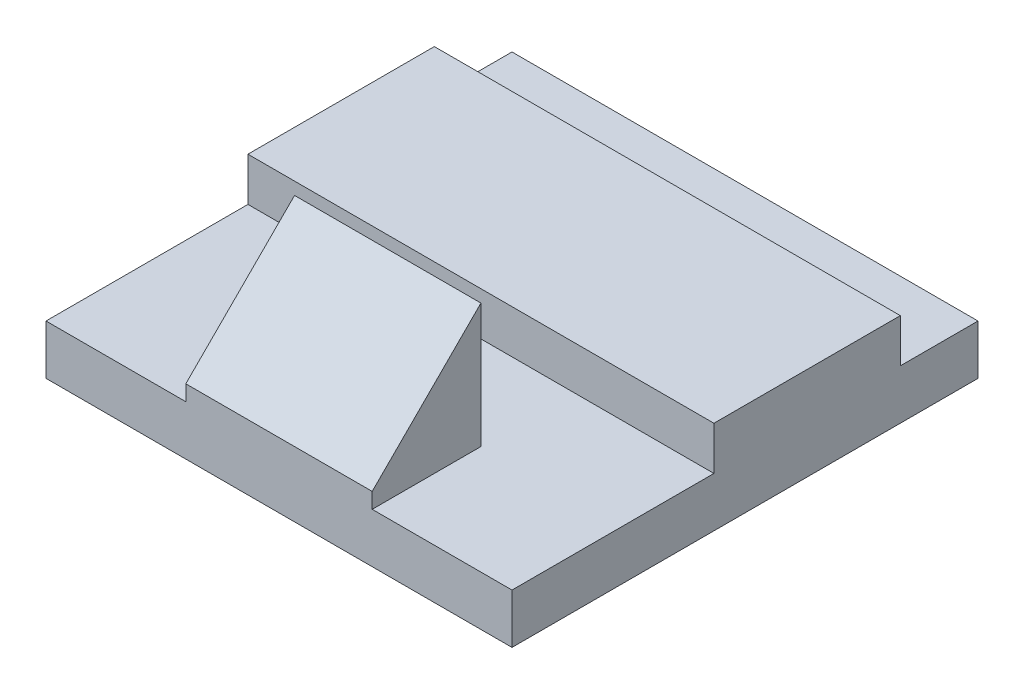
ISO-10303-21;
HEADER;
FILE_DESCRIPTION(('STEP AP214'),'2;1');
FILE_NAME('part.step','',(''),(''),'','','');
FILE_SCHEMA(('AUTOMOTIVE_DESIGN { 1 0 10303 214 1 1 1 1 }'));
ENDSEC;
DATA;
#1=APPLICATION_CONTEXT('core data for automotive mechanical design processes');
#2=APPLICATION_PROTOCOL_DEFINITION('international standard','automotive_design',2000,#1);
#3=PRODUCT_CONTEXT('',#1,'mechanical');
#4=PRODUCT('Part','Part','',(#3));
#5=PRODUCT_RELATED_PRODUCT_CATEGORY('part','',(#4));
#6=PRODUCT_DEFINITION_FORMATION('','',#4);
#7=PRODUCT_DEFINITION_CONTEXT('part definition',#1,'design');
#8=PRODUCT_DEFINITION('design','',#6,#7);
#9=PRODUCT_DEFINITION_SHAPE('','',#8);
#10=(LENGTH_UNIT() NAMED_UNIT(*) SI_UNIT(.MILLI.,.METRE.));
#11=(NAMED_UNIT(*) PLANE_ANGLE_UNIT() SI_UNIT($,.RADIAN.));
#12=(NAMED_UNIT(*) SI_UNIT($,.STERADIAN.) SOLID_ANGLE_UNIT());
#13=UNCERTAINTY_MEASURE_WITH_UNIT(LENGTH_MEASURE(1.E-05),#10,'distance_accuracy_value','');
#14=(GEOMETRIC_REPRESENTATION_CONTEXT(3) GLOBAL_UNCERTAINTY_ASSIGNED_CONTEXT((#13)) GLOBAL_UNIT_ASSIGNED_CONTEXT((#10,
#11,#12)) REPRESENTATION_CONTEXT('',''));
#15=CARTESIAN_POINT('',(0.,0.,0.));
#16=DIRECTION('',(0.,0.,1.));
#17=DIRECTION('',(1.,0.,0.));
#18=AXIS2_PLACEMENT_3D('',#15,#16,#17);
#19=CARTESIAN_POINT('',(0.,32.,0.));
#20=DIRECTION('',(0.,1.,0.));
#21=DIRECTION('',(0.,0.,1.));
#22=AXIS2_PLACEMENT_3D('',#19,#20,#21);
#23=PLANE('',#22);
#24=DIRECTION('',(1.,0.,0.));
#25=VECTOR('',#24,1.);
#26=CARTESIAN_POINT('',(-150.,32.,150.));
#27=LINE('',#26,#25);
#28=CARTESIAN_POINT('',(-150.,32.,150.));
#29=VERTEX_POINT('',#28);
#30=CARTESIAN_POINT('',(-59.9999999999999,32.,150.));
#31=VERTEX_POINT('',#30);
#32=EDGE_CURVE('E184',#29,#31,#27,.T.);
#33=ORIENTED_EDGE('',*,*,#32,.T.);
#34=DIRECTION('',(0.,0.,1.));
#35=VECTOR('',#34,1.);
#36=CARTESIAN_POINT('',(-59.9999999999999,32.,150.));
#37=LINE('',#36,#35);
#38=CARTESIAN_POINT('',(-59.9999999999999,32.,80.));
#39=VERTEX_POINT('',#38);
#40=EDGE_CURVE('E145',#39,#31,#37,.T.);
#41=ORIENTED_EDGE('',*,*,#40,.F.);
#42=DIRECTION('',(-1.,0.,0.));
#43=VECTOR('',#42,1.);
#44=CARTESIAN_POINT('',(-59.9999999999999,32.,80.));
#45=LINE('',#44,#43);
#46=CARTESIAN_POINT('',(60.0000000000001,32.,80.));
#47=VERTEX_POINT('',#46);
#48=EDGE_CURVE('E240',#47,#39,#45,.T.);
#49=ORIENTED_EDGE('',*,*,#48,.F.);
#50=DIRECTION('',(0.,0.,-1.));
#51=VECTOR('',#50,1.);
#52=CARTESIAN_POINT('',(60.0000000000001,32.,150.));
#53=LINE('',#52,#51);
#54=CARTESIAN_POINT('',(60.0000000000001,32.,150.));
#55=VERTEX_POINT('',#54);
#56=EDGE_CURVE('E241',#55,#47,#53,.T.);
#57=ORIENTED_EDGE('',*,*,#56,.F.);
#58=CARTESIAN_POINT('',(150.,32.,150.));
#59=VERTEX_POINT('',#58);
#60=EDGE_CURVE('E182',#55,#59,#27,.T.);
#61=ORIENTED_EDGE('',*,*,#60,.T.);
#62=DIRECTION('',(0.,0.,-1.));
#63=VECTOR('',#62,1.);
#64=CARTESIAN_POINT('',(150.,32.,-150.));
#65=LINE('',#64,#63);
#66=CARTESIAN_POINT('',(150.,32.,20.));
#67=VERTEX_POINT('',#66);
#68=EDGE_CURVE('E187',#59,#67,#65,.T.);
#69=ORIENTED_EDGE('',*,*,#68,.T.);
#70=DIRECTION('',(1.,0.,0.));
#71=VECTOR('',#70,1.);
#72=CARTESIAN_POINT('',(-150.,32.,20.));
#73=LINE('',#72,#71);
#74=CARTESIAN_POINT('',(-150.,32.,20.));
#75=VERTEX_POINT('',#74);
#76=EDGE_CURVE('E150',#75,#67,#73,.T.);
#77=ORIENTED_EDGE('',*,*,#76,.F.);
#78=DIRECTION('',(0.,0.,1.));
#79=VECTOR('',#78,1.);
#80=CARTESIAN_POINT('',(-150.,32.,-150.));
#81=LINE('',#80,#79);
#82=EDGE_CURVE('E183',#75,#29,#81,.T.);
#83=ORIENTED_EDGE('',*,*,#82,.T.);
#84=EDGE_LOOP('',(#33,#41,#49,#57,#61,#69,#77,#83));
#85=FACE_BOUND('',#84,.T.);
#86=ADVANCED_FACE('F36',(#85),#23,.T.);
#87=DIRECTION('',(-1.,0.,0.));
#88=VECTOR('',#87,1.);
#89=CARTESIAN_POINT('',(-150.,32.,-100.));
#90=LINE('',#89,#88);
#91=CARTESIAN_POINT('',(150.,32.,-100.));
#92=VERTEX_POINT('',#91);
#93=CARTESIAN_POINT('',(-150.,32.,-100.));
#94=VERTEX_POINT('',#93);
#95=EDGE_CURVE('E59',#92,#94,#90,.T.);
#96=ORIENTED_EDGE('',*,*,#95,.F.);
#97=CARTESIAN_POINT('',(150.,32.,-150.));
#98=VERTEX_POINT('',#97);
#99=EDGE_CURVE('E186',#92,#98,#65,.T.);
#100=ORIENTED_EDGE('',*,*,#99,.T.);
#101=DIRECTION('',(-1.,0.,0.));
#102=VECTOR('',#101,1.);
#103=CARTESIAN_POINT('',(-150.,32.,-150.));
#104=LINE('',#103,#102);
#105=CARTESIAN_POINT('',(-150.,32.,-150.));
#106=VERTEX_POINT('',#105);
#107=EDGE_CURVE('E189',#98,#106,#104,.T.);
#108=ORIENTED_EDGE('',*,*,#107,.T.);
#109=EDGE_CURVE('E180',#106,#94,#81,.T.);
#110=ORIENTED_EDGE('',*,*,#109,.T.);
#111=EDGE_LOOP('',(#96,#100,#108,#110));
#112=FACE_BOUND('',#111,.T.);
#113=ADVANCED_FACE('F224',(#112),#23,.T.);
#114=CARTESIAN_POINT('',(-150.,32.,-150.));
#115=DIRECTION('',(1.,0.,0.));
#116=DIRECTION('',(0.,0.,-1.));
#117=AXIS2_PLACEMENT_3D('',#114,#115,#116);
#118=PLANE('',#117);
#119=DIRECTION('',(0.,0.,1.));
#120=VECTOR('',#119,1.);
#121=CARTESIAN_POINT('',(-150.,0.,-150.));
#122=LINE('',#121,#120);
#123=CARTESIAN_POINT('',(-150.,0.,-150.));
#124=VERTEX_POINT('',#123);
#125=CARTESIAN_POINT('',(-150.,0.,150.));
#126=VERTEX_POINT('',#125);
#127=EDGE_CURVE('E179',#124,#126,#122,.T.);
#128=ORIENTED_EDGE('',*,*,#127,.T.);
#129=DIRECTION('',(0.,-1.,0.));
#130=VECTOR('',#129,1.);
#131=CARTESIAN_POINT('',(-150.,32.,150.));
#132=LINE('',#131,#130);
#133=EDGE_CURVE('E11',#29,#126,#132,.T.);
#134=ORIENTED_EDGE('',*,*,#133,.F.);
#135=ORIENTED_EDGE('',*,*,#82,.F.);
#136=DIRECTION('',(0.,-1.,0.));
#137=VECTOR('',#136,1.);
#138=CARTESIAN_POINT('',(-150.,60.,20.));
#139=LINE('',#138,#137);
#140=CARTESIAN_POINT('',(-150.,60.,20.));
#141=VERTEX_POINT('',#140);
#142=EDGE_CURVE('E176',#141,#75,#139,.T.);
#143=ORIENTED_EDGE('',*,*,#142,.F.);
#144=DIRECTION('',(0.,0.,1.));
#145=VECTOR('',#144,1.);
#146=CARTESIAN_POINT('',(-150.,60.,-100.));
#147=LINE('',#146,#145);
#148=CARTESIAN_POINT('',(-150.,60.,-100.));
#149=VERTEX_POINT('',#148);
#150=EDGE_CURVE('E157',#149,#141,#147,.T.);
#151=ORIENTED_EDGE('',*,*,#150,.F.);
#152=DIRECTION('',(0.,-1.,0.));
#153=VECTOR('',#152,1.);
#154=CARTESIAN_POINT('',(-150.,60.,-100.));
#155=LINE('',#154,#153);
#156=EDGE_CURVE('E165',#149,#94,#155,.T.);
#157=ORIENTED_EDGE('',*,*,#156,.T.);
#158=ORIENTED_EDGE('',*,*,#109,.F.);
#159=DIRECTION('',(0.,-1.,0.));
#160=VECTOR('',#159,1.);
#161=CARTESIAN_POINT('',(-150.,32.,-150.));
#162=LINE('',#161,#160);
#163=EDGE_CURVE('E191',#106,#124,#162,.T.);
#164=ORIENTED_EDGE('',*,*,#163,.T.);
#165=EDGE_LOOP('',(#128,#134,#135,#143,#151,#157,#158,#164));
#166=FACE_BOUND('',#165,.T.);
#167=ADVANCED_FACE('F38',(#166),#118,.F.);
#168=CARTESIAN_POINT('',(-150.,32.,150.));
#169=DIRECTION('',(0.,0.,-1.));
#170=DIRECTION('',(-1.,0.,0.));
#171=AXIS2_PLACEMENT_3D('',#168,#169,#170);
#172=PLANE('',#171);
#173=DIRECTION('',(0.,-1.,0.));
#174=VECTOR('',#173,1.);
#175=CARTESIAN_POINT('',(60.0000000000001,112.,150.));
#176=LINE('',#175,#174);
#177=CARTESIAN_POINT('',(60.0000000000001,42.0000000000007,150.));
#178=VERTEX_POINT('',#177);
#179=EDGE_CURVE('E144',#178,#55,#176,.T.);
#180=ORIENTED_EDGE('',*,*,#179,.F.);
#181=DIRECTION('',(1.,0.,0.));
#182=VECTOR('',#181,1.);
#183=CARTESIAN_POINT('',(-59.9999999999999,42.0000000000007,150.));
#184=LINE('',#183,#182);
#185=CARTESIAN_POINT('',(-59.9999999999999,42.0000000000007,150.));
#186=VERTEX_POINT('',#185);
#187=EDGE_CURVE('E128',#186,#178,#184,.T.);
#188=ORIENTED_EDGE('',*,*,#187,.F.);
#189=DIRECTION('',(0.,-1.,0.));
#190=VECTOR('',#189,1.);
#191=CARTESIAN_POINT('',(-59.9999999999999,112.,150.));
#192=LINE('',#191,#190);
#193=EDGE_CURVE('E141',#186,#31,#192,.T.);
#194=ORIENTED_EDGE('',*,*,#193,.T.);
#195=ORIENTED_EDGE('',*,*,#32,.F.);
#196=ORIENTED_EDGE('',*,*,#133,.T.);
#197=DIRECTION('',(1.,0.,0.));
#198=VECTOR('',#197,1.);
#199=CARTESIAN_POINT('',(-150.,0.,150.));
#200=LINE('',#199,#198);
#201=CARTESIAN_POINT('',(150.,0.,150.));
#202=VERTEX_POINT('',#201);
#203=EDGE_CURVE('E194',#126,#202,#200,.T.);
#204=ORIENTED_EDGE('',*,*,#203,.T.);
#205=DIRECTION('',(0.,-1.,0.));
#206=VECTOR('',#205,1.);
#207=CARTESIAN_POINT('',(150.,32.,150.));
#208=LINE('',#207,#206);
#209=EDGE_CURVE('E44',#59,#202,#208,.T.);
#210=ORIENTED_EDGE('',*,*,#209,.F.);
#211=ORIENTED_EDGE('',*,*,#60,.F.);
#212=EDGE_LOOP('',(#180,#188,#194,#195,#196,#204,#210,#211));
#213=FACE_BOUND('',#212,.T.);
#214=ADVANCED_FACE('F139',(#213),#172,.F.);
#215=CARTESIAN_POINT('',(150.,32.,-150.));
#216=DIRECTION('',(-1.,0.,0.));
#217=DIRECTION('',(0.,0.,1.));
#218=AXIS2_PLACEMENT_3D('',#215,#216,#217);
#219=PLANE('',#218);
#220=DIRECTION('',(0.,0.,-1.));
#221=VECTOR('',#220,1.);
#222=CARTESIAN_POINT('',(150.,0.,-150.));
#223=LINE('',#222,#221);
#224=CARTESIAN_POINT('',(150.,0.,-150.));
#225=VERTEX_POINT('',#224);
#226=EDGE_CURVE('E196',#202,#225,#223,.T.);
#227=ORIENTED_EDGE('',*,*,#226,.T.);
#228=DIRECTION('',(0.,-1.,0.));
#229=VECTOR('',#228,1.);
#230=CARTESIAN_POINT('',(150.,32.,-150.));
#231=LINE('',#230,#229);
#232=EDGE_CURVE('E202',#98,#225,#231,.T.);
#233=ORIENTED_EDGE('',*,*,#232,.F.);
#234=ORIENTED_EDGE('',*,*,#99,.F.);
#235=DIRECTION('',(0.,-1.,0.));
#236=VECTOR('',#235,1.);
#237=CARTESIAN_POINT('',(150.,60.,-100.));
#238=LINE('',#237,#236);
#239=CARTESIAN_POINT('',(150.,60.,-100.));
#240=VERTEX_POINT('',#239);
#241=EDGE_CURVE('E170',#240,#92,#238,.T.);
#242=ORIENTED_EDGE('',*,*,#241,.F.);
#243=DIRECTION('',(0.,0.,-1.));
#244=VECTOR('',#243,1.);
#245=CARTESIAN_POINT('',(150.,60.,-100.));
#246=LINE('',#245,#244);
#247=CARTESIAN_POINT('',(150.,60.,20.));
#248=VERTEX_POINT('',#247);
#249=EDGE_CURVE('E162',#248,#240,#246,.T.);
#250=ORIENTED_EDGE('',*,*,#249,.F.);
#251=DIRECTION('',(0.,-1.,0.));
#252=VECTOR('',#251,1.);
#253=CARTESIAN_POINT('',(150.,60.,20.));
#254=LINE('',#253,#252);
#255=EDGE_CURVE('E173',#248,#67,#254,.T.);
#256=ORIENTED_EDGE('',*,*,#255,.T.);
#257=ORIENTED_EDGE('',*,*,#68,.F.);
#258=ORIENTED_EDGE('',*,*,#209,.T.);
#259=EDGE_LOOP('',(#227,#233,#234,#242,#250,#256,#257,#258));
#260=FACE_BOUND('',#259,.T.);
#261=ADVANCED_FACE('F209',(#260),#219,.F.);
#262=CARTESIAN_POINT('',(-150.,32.,-150.));
#263=DIRECTION('',(0.,0.,1.));
#264=DIRECTION('',(1.,0.,0.));
#265=AXIS2_PLACEMENT_3D('',#262,#263,#264);
#266=PLANE('',#265);
#267=DIRECTION('',(-1.,0.,0.));
#268=VECTOR('',#267,1.);
#269=CARTESIAN_POINT('',(-150.,0.,-150.));
#270=LINE('',#269,#268);
#271=EDGE_CURVE('E198',#225,#124,#270,.T.);
#272=ORIENTED_EDGE('',*,*,#271,.T.);
#273=ORIENTED_EDGE('',*,*,#163,.F.);
#274=ORIENTED_EDGE('',*,*,#107,.F.);
#275=ORIENTED_EDGE('',*,*,#232,.T.);
#276=EDGE_LOOP('',(#272,#273,#274,#275));
#277=FACE_BOUND('',#276,.T.);
#278=ADVANCED_FACE('F217',(#277),#266,.F.);
#279=CARTESIAN_POINT('',(0.,0.,0.));
#280=DIRECTION('',(0.,1.,0.));
#281=DIRECTION('',(0.,0.,1.));
#282=AXIS2_PLACEMENT_3D('',#279,#280,#281);
#283=PLANE('',#282);
#284=ORIENTED_EDGE('',*,*,#127,.F.);
#285=ORIENTED_EDGE('',*,*,#271,.F.);
#286=ORIENTED_EDGE('',*,*,#226,.F.);
#287=ORIENTED_EDGE('',*,*,#203,.F.);
#288=EDGE_LOOP('',(#284,#285,#286,#287));
#289=FACE_BOUND('',#288,.T.);
#290=ADVANCED_FACE('F214',(#289),#283,.F.);
#291=CARTESIAN_POINT('',(-150.,60.,20.));
#292=DIRECTION('',(0.,0.,-1.));
#293=DIRECTION('',(-1.,0.,0.));
#294=AXIS2_PLACEMENT_3D('',#291,#292,#293);
#295=PLANE('',#294);
#296=ORIENTED_EDGE('',*,*,#76,.T.);
#297=ORIENTED_EDGE('',*,*,#255,.F.);
#298=DIRECTION('',(1.,0.,0.));
#299=VECTOR('',#298,1.);
#300=CARTESIAN_POINT('',(-150.,60.,20.));
#301=LINE('',#300,#299);
#302=EDGE_CURVE('E160',#141,#248,#301,.T.);
#303=ORIENTED_EDGE('',*,*,#302,.F.);
#304=ORIENTED_EDGE('',*,*,#142,.T.);
#305=EDGE_LOOP('',(#296,#297,#303,#304));
#306=FACE_BOUND('',#305,.T.);
#307=ADVANCED_FACE('F235',(#306),#295,.F.);
#308=CARTESIAN_POINT('',(-150.,60.,-100.));
#309=DIRECTION('',(0.,0.,1.));
#310=DIRECTION('',(1.,0.,0.));
#311=AXIS2_PLACEMENT_3D('',#308,#309,#310);
#312=PLANE('',#311);
#313=ORIENTED_EDGE('',*,*,#95,.T.);
#314=ORIENTED_EDGE('',*,*,#156,.F.);
#315=DIRECTION('',(-1.,0.,0.));
#316=VECTOR('',#315,1.);
#317=CARTESIAN_POINT('',(-150.,60.,-100.));
#318=LINE('',#317,#316);
#319=EDGE_CURVE('E164',#240,#149,#318,.T.);
#320=ORIENTED_EDGE('',*,*,#319,.F.);
#321=ORIENTED_EDGE('',*,*,#241,.T.);
#322=EDGE_LOOP('',(#313,#314,#320,#321));
#323=FACE_BOUND('',#322,.T.);
#324=ADVANCED_FACE('F226',(#323),#312,.F.);
#325=CARTESIAN_POINT('',(0.,60.,0.));
#326=DIRECTION('',(0.,1.,0.));
#327=DIRECTION('',(0.,0.,1.));
#328=AXIS2_PLACEMENT_3D('',#325,#326,#327);
#329=PLANE('',#328);
#330=ORIENTED_EDGE('',*,*,#150,.T.);
#331=ORIENTED_EDGE('',*,*,#302,.T.);
#332=ORIENTED_EDGE('',*,*,#249,.T.);
#333=ORIENTED_EDGE('',*,*,#319,.T.);
#334=EDGE_LOOP('',(#330,#331,#332,#333));
#335=FACE_BOUND('',#334,.T.);
#336=ADVANCED_FACE('F232',(#335),#329,.T.);
#337=CARTESIAN_POINT('',(-59.9999999999999,112.,150.));
#338=DIRECTION('',(1.,0.,0.));
#339=DIRECTION('',(0.,0.,-1.));
#340=AXIS2_PLACEMENT_3D('',#337,#338,#339);
#341=PLANE('',#340);
#342=ORIENTED_EDGE('',*,*,#193,.F.);
#343=DIRECTION('',(0.,0.707106781186544,-0.707106781186551));
#344=VECTOR('',#343,1.);
#345=CARTESIAN_POINT('',(-59.9999999999999,112.,80.));
#346=LINE('',#345,#344);
#347=CARTESIAN_POINT('',(-59.9999999999999,112.,80.));
#348=VERTEX_POINT('',#347);
#349=EDGE_CURVE('E125',#186,#348,#346,.T.);
#350=ORIENTED_EDGE('',*,*,#349,.T.);
#351=DIRECTION('',(0.,-1.,0.));
#352=VECTOR('',#351,1.);
#353=CARTESIAN_POINT('',(-59.9999999999999,112.,80.));
#354=LINE('',#353,#352);
#355=EDGE_CURVE('E247',#348,#39,#354,.T.);
#356=ORIENTED_EDGE('',*,*,#355,.T.);
#357=ORIENTED_EDGE('',*,*,#40,.T.);
#358=EDGE_LOOP('',(#342,#350,#356,#357));
#359=FACE_BOUND('',#358,.T.);
#360=ADVANCED_FACE('F147',(#359),#341,.F.);
#361=CARTESIAN_POINT('',(60.0000000000001,112.,150.));
#362=DIRECTION('',(-1.,0.,0.));
#363=DIRECTION('',(0.,0.,1.));
#364=AXIS2_PLACEMENT_3D('',#361,#362,#363);
#365=PLANE('',#364);
#366=DIRECTION('',(0.,-1.,0.));
#367=VECTOR('',#366,1.);
#368=CARTESIAN_POINT('',(60.0000000000001,112.,80.));
#369=LINE('',#368,#367);
#370=CARTESIAN_POINT('',(60.0000000000001,112.,80.));
#371=VERTEX_POINT('',#370);
#372=EDGE_CURVE('E51',#371,#47,#369,.T.);
#373=ORIENTED_EDGE('',*,*,#372,.F.);
#374=DIRECTION('',(0.,0.707106781186544,-0.707106781186551));
#375=VECTOR('',#374,1.);
#376=CARTESIAN_POINT('',(60.0000000000001,112.,80.));
#377=LINE('',#376,#375);
#378=EDGE_CURVE('E135',#178,#371,#377,.T.);
#379=ORIENTED_EDGE('',*,*,#378,.F.);
#380=ORIENTED_EDGE('',*,*,#179,.T.);
#381=ORIENTED_EDGE('',*,*,#56,.T.);
#382=EDGE_LOOP('',(#373,#379,#380,#381));
#383=FACE_BOUND('',#382,.T.);
#384=ADVANCED_FACE('F250',(#383),#365,.F.);
#385=CARTESIAN_POINT('',(-59.9999999999999,112.,80.));
#386=DIRECTION('',(0.,0.,1.));
#387=DIRECTION('',(1.,0.,0.));
#388=AXIS2_PLACEMENT_3D('',#385,#386,#387);
#389=PLANE('',#388);
#390=ORIENTED_EDGE('',*,*,#48,.T.);
#391=ORIENTED_EDGE('',*,*,#355,.F.);
#392=DIRECTION('',(-1.,0.,0.));
#393=VECTOR('',#392,1.);
#394=CARTESIAN_POINT('',(-59.9999999999999,112.,80.));
#395=LINE('',#394,#393);
#396=EDGE_CURVE('E130',#371,#348,#395,.T.);
#397=ORIENTED_EDGE('',*,*,#396,.F.);
#398=ORIENTED_EDGE('',*,*,#372,.T.);
#399=EDGE_LOOP('',(#390,#391,#397,#398));
#400=FACE_BOUND('',#399,.T.);
#401=ADVANCED_FACE('F248',(#400),#389,.F.);
#402=CARTESIAN_POINT('',(-59.9999999999999,112.,80.));
#403=DIRECTION('',(0.,-0.707106781186551,-0.707106781186544));
#404=DIRECTION('',(0.,0.707106781186544,-0.707106781186551));
#405=AXIS2_PLACEMENT_3D('',#402,#403,#404);
#406=PLANE('',#405);
#407=ORIENTED_EDGE('',*,*,#378,.T.);
#408=ORIENTED_EDGE('',*,*,#396,.T.);
#409=ORIENTED_EDGE('',*,*,#349,.F.);
#410=ORIENTED_EDGE('',*,*,#187,.T.);
#411=EDGE_LOOP('',(#407,#408,#409,#410));
#412=FACE_BOUND('',#411,.T.);
#413=ADVANCED_FACE('F127',(#412),#406,.F.);
#414=CLOSED_SHELL('',(#86,#113,#167,#214,#261,#278,#290,#307,#324,#336,#360,#384,#401,#413));
#415=MANIFOLD_SOLID_BREP('B2',#414);
#416=ADVANCED_BREP_SHAPE_REPRESENTATION('',(#18,#415),#14);
#417=SHAPE_DEFINITION_REPRESENTATION(#9,#416);
ENDSEC;
END-ISO-10303-21;
